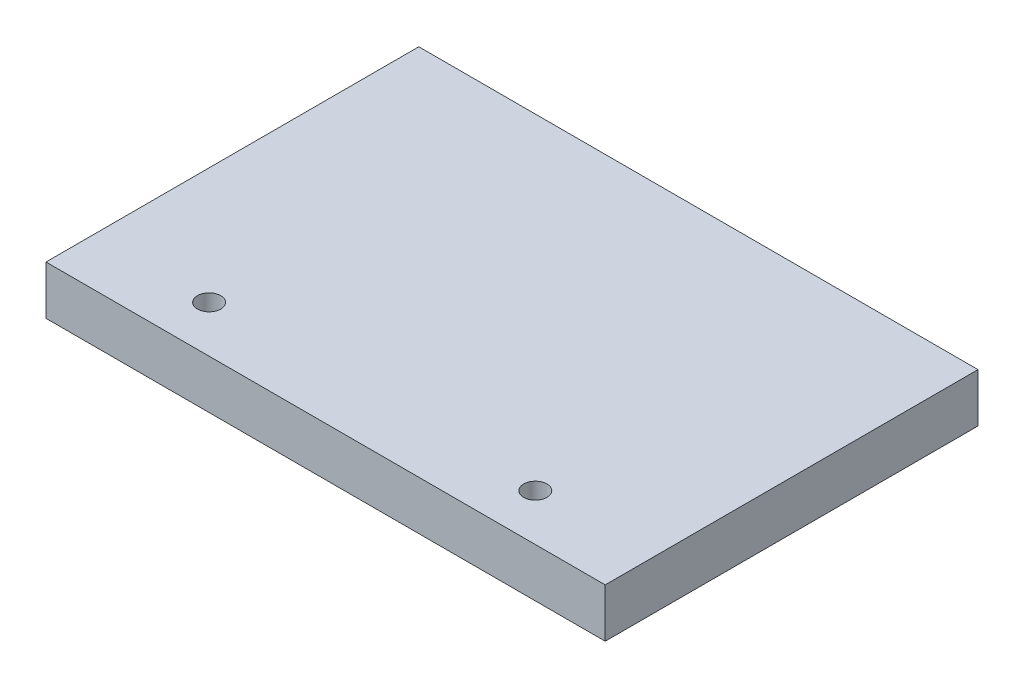
ISO-10303-21;
HEADER;
FILE_DESCRIPTION(('STEP AP214'),'2;1');
FILE_NAME('part.step','',(''),(''),'','','');
FILE_SCHEMA(('AUTOMOTIVE_DESIGN { 1 0 10303 214 1 1 1 1 }'));
ENDSEC;
DATA;
#1=APPLICATION_CONTEXT('core data for automotive mechanical design processes');
#2=APPLICATION_PROTOCOL_DEFINITION('international standard','automotive_design',2000,#1);
#3=PRODUCT_CONTEXT('',#1,'mechanical');
#4=PRODUCT('Part','Part','',(#3));
#5=PRODUCT_RELATED_PRODUCT_CATEGORY('part','',(#4));
#6=PRODUCT_DEFINITION_FORMATION('','',#4);
#7=PRODUCT_DEFINITION_CONTEXT('part definition',#1,'design');
#8=PRODUCT_DEFINITION('design','',#6,#7);
#9=PRODUCT_DEFINITION_SHAPE('','',#8);
#10=(LENGTH_UNIT() NAMED_UNIT(*) SI_UNIT(.MILLI.,.METRE.));
#11=(NAMED_UNIT(*) PLANE_ANGLE_UNIT() SI_UNIT($,.RADIAN.));
#12=(NAMED_UNIT(*) SI_UNIT($,.STERADIAN.) SOLID_ANGLE_UNIT());
#13=UNCERTAINTY_MEASURE_WITH_UNIT(LENGTH_MEASURE(1.E-05),#10,'distance_accuracy_value','');
#14=(GEOMETRIC_REPRESENTATION_CONTEXT(3) GLOBAL_UNCERTAINTY_ASSIGNED_CONTEXT((#13)) GLOBAL_UNIT_ASSIGNED_CONTEXT((#10,
#11,#12)) REPRESENTATION_CONTEXT('',''));
#15=CARTESIAN_POINT('',(0.,0.,0.));
#16=DIRECTION('',(0.,0.,1.));
#17=DIRECTION('',(1.,0.,0.));
#18=AXIS2_PLACEMENT_3D('',#15,#16,#17);
#19=CARTESIAN_POINT('',(0.,6.6548,0.));
#20=DIRECTION('',(1.,0.,0.));
#21=DIRECTION('',(0.,0.,-1.));
#22=AXIS2_PLACEMENT_3D('',#19,#20,#21);
#23=PLANE('',#22);
#24=DIRECTION('',(0.,0.,1.));
#25=VECTOR('',#24,1.);
#26=CARTESIAN_POINT('',(0.,0.,0.));
#27=LINE('',#26,#25);
#28=CARTESIAN_POINT('',(0.,0.,-50.8));
#29=VERTEX_POINT('',#28);
#30=CARTESIAN_POINT('',(0.,0.,0.));
#31=VERTEX_POINT('',#30);
#32=EDGE_CURVE('E95',#29,#31,#27,.T.);
#33=ORIENTED_EDGE('',*,*,#32,.T.);
#34=DIRECTION('',(0.,-1.,0.));
#35=VECTOR('',#34,1.);
#36=CARTESIAN_POINT('',(0.,6.6548,0.));
#37=LINE('',#36,#35);
#38=CARTESIAN_POINT('',(0.,6.6548,0.));
#39=VERTEX_POINT('',#38);
#40=EDGE_CURVE('E11',#39,#31,#37,.T.);
#41=ORIENTED_EDGE('',*,*,#40,.F.);
#42=DIRECTION('',(0.,0.,1.));
#43=VECTOR('',#42,1.);
#44=CARTESIAN_POINT('',(0.,6.6548,0.));
#45=LINE('',#44,#43);
#46=CARTESIAN_POINT('',(0.,6.6548,-50.8));
#47=VERTEX_POINT('',#46);
#48=EDGE_CURVE('E83',#47,#39,#45,.T.);
#49=ORIENTED_EDGE('',*,*,#48,.F.);
#50=DIRECTION('',(0.,-1.,0.));
#51=VECTOR('',#50,1.);
#52=CARTESIAN_POINT('',(0.,6.6548,-50.8));
#53=LINE('',#52,#51);
#54=EDGE_CURVE('E91',#47,#29,#53,.T.);
#55=ORIENTED_EDGE('',*,*,#54,.T.);
#56=EDGE_LOOP('',(#33,#41,#49,#55));
#57=FACE_BOUND('',#56,.T.);
#58=ADVANCED_FACE('F32',(#57),#23,.F.);
#59=CARTESIAN_POINT('',(0.,6.6548,0.));
#60=DIRECTION('',(0.,0.,-1.));
#61=DIRECTION('',(-1.,0.,0.));
#62=AXIS2_PLACEMENT_3D('',#59,#60,#61);
#63=PLANE('',#62);
#64=DIRECTION('',(1.,0.,0.));
#65=VECTOR('',#64,1.);
#66=CARTESIAN_POINT('',(0.,0.,0.));
#67=LINE('',#66,#65);
#68=CARTESIAN_POINT('',(76.2,0.,0.));
#69=VERTEX_POINT('',#68);
#70=EDGE_CURVE('E87',#31,#69,#67,.T.);
#71=ORIENTED_EDGE('',*,*,#70,.T.);
#72=DIRECTION('',(0.,-1.,0.));
#73=VECTOR('',#72,1.);
#74=CARTESIAN_POINT('',(76.2,6.6548,0.));
#75=LINE('',#74,#73);
#76=CARTESIAN_POINT('',(76.2,6.6548,0.));
#77=VERTEX_POINT('',#76);
#78=EDGE_CURVE('E40',#77,#69,#75,.T.);
#79=ORIENTED_EDGE('',*,*,#78,.F.);
#80=DIRECTION('',(1.,0.,0.));
#81=VECTOR('',#80,1.);
#82=CARTESIAN_POINT('',(0.,6.6548,0.));
#83=LINE('',#82,#81);
#84=EDGE_CURVE('E78',#39,#77,#83,.T.);
#85=ORIENTED_EDGE('',*,*,#84,.F.);
#86=ORIENTED_EDGE('',*,*,#40,.T.);
#87=EDGE_LOOP('',(#71,#79,#85,#86));
#88=FACE_BOUND('',#87,.T.);
#89=ADVANCED_FACE('F86',(#88),#63,.F.);
#90=CARTESIAN_POINT('',(76.2,6.6548,0.));
#91=DIRECTION('',(-1.,0.,0.));
#92=DIRECTION('',(0.,0.,1.));
#93=AXIS2_PLACEMENT_3D('',#90,#91,#92);
#94=PLANE('',#93);
#95=DIRECTION('',(0.,0.,-1.));
#96=VECTOR('',#95,1.);
#97=CARTESIAN_POINT('',(76.2,0.,0.));
#98=LINE('',#97,#96);
#99=CARTESIAN_POINT('',(76.2,0.,-50.8));
#100=VERTEX_POINT('',#99);
#101=EDGE_CURVE('E65',#69,#100,#98,.T.);
#102=ORIENTED_EDGE('',*,*,#101,.T.);
#103=DIRECTION('',(0.,-1.,0.));
#104=VECTOR('',#103,1.);
#105=CARTESIAN_POINT('',(76.2,6.6548,-50.8));
#106=LINE('',#105,#104);
#107=CARTESIAN_POINT('',(76.2,6.6548,-50.8));
#108=VERTEX_POINT('',#107);
#109=EDGE_CURVE('E88',#108,#100,#106,.T.);
#110=ORIENTED_EDGE('',*,*,#109,.F.);
#111=DIRECTION('',(0.,0.,-1.));
#112=VECTOR('',#111,1.);
#113=CARTESIAN_POINT('',(76.2,6.6548,0.));
#114=LINE('',#113,#112);
#115=EDGE_CURVE('E81',#77,#108,#114,.T.);
#116=ORIENTED_EDGE('',*,*,#115,.F.);
#117=ORIENTED_EDGE('',*,*,#78,.T.);
#118=EDGE_LOOP('',(#102,#110,#116,#117));
#119=FACE_BOUND('',#118,.T.);
#120=ADVANCED_FACE('F89',(#119),#94,.F.);
#121=CARTESIAN_POINT('',(0.,6.6548,-50.8));
#122=DIRECTION('',(0.,0.,1.));
#123=DIRECTION('',(1.,0.,0.));
#124=AXIS2_PLACEMENT_3D('',#121,#122,#123);
#125=PLANE('',#124);
#126=DIRECTION('',(-1.,0.,0.));
#127=VECTOR('',#126,1.);
#128=CARTESIAN_POINT('',(0.,0.,-50.8));
#129=LINE('',#128,#127);
#130=EDGE_CURVE('E71',#100,#29,#129,.T.);
#131=ORIENTED_EDGE('',*,*,#130,.T.);
#132=ORIENTED_EDGE('',*,*,#54,.F.);
#133=DIRECTION('',(-1.,0.,0.));
#134=VECTOR('',#133,1.);
#135=CARTESIAN_POINT('',(0.,6.6548,-50.8));
#136=LINE('',#135,#134);
#137=EDGE_CURVE('E48',#108,#47,#136,.T.);
#138=ORIENTED_EDGE('',*,*,#137,.F.);
#139=ORIENTED_EDGE('',*,*,#109,.T.);
#140=EDGE_LOOP('',(#131,#132,#138,#139));
#141=FACE_BOUND('',#140,.T.);
#142=ADVANCED_FACE('F103',(#141),#125,.F.);
#143=CARTESIAN_POINT('',(0.,6.6548,0.));
#144=DIRECTION('',(0.,-1.,0.));
#145=DIRECTION('',(0.,0.,-1.));
#146=AXIS2_PLACEMENT_3D('',#143,#144,#145);
#147=PLANE('',#146);
#148=CARTESIAN_POINT('',(15.875,6.6548,-6.35));
#149=DIRECTION('',(0.,1.,0.));
#150=DIRECTION('',(0.,0.,1.));
#151=AXIS2_PLACEMENT_3D('',#148,#149,#150);
#152=CIRCLE('',#151,1.5875);
#153=CARTESIAN_POINT('',(15.875,6.6548,-4.7625));
#154=VERTEX_POINT('',#153);
#155=EDGE_CURVE('E115',#154,#154,#152,.T.);
#156=ORIENTED_EDGE('',*,*,#155,.F.);
#157=EDGE_LOOP('',(#156));
#158=FACE_BOUND('',#157,.T.);
#159=CARTESIAN_POINT('',(60.325,6.6548,-6.35000000000001));
#160=DIRECTION('',(0.,1.,0.));
#161=DIRECTION('',(0.,0.,1.));
#162=AXIS2_PLACEMENT_3D('',#159,#160,#161);
#163=CIRCLE('',#162,1.5875);
#164=CARTESIAN_POINT('',(60.325,6.6548,-4.76250000000001));
#165=VERTEX_POINT('',#164);
#166=EDGE_CURVE('E109',#165,#165,#163,.T.);
#167=ORIENTED_EDGE('',*,*,#166,.F.);
#168=EDGE_LOOP('',(#167));
#169=FACE_BOUND('',#168,.T.);
#170=ORIENTED_EDGE('',*,*,#48,.T.);
#171=ORIENTED_EDGE('',*,*,#84,.T.);
#172=ORIENTED_EDGE('',*,*,#115,.T.);
#173=ORIENTED_EDGE('',*,*,#137,.T.);
#174=EDGE_LOOP('',(#170,#171,#172,#173));
#175=FACE_BOUND('',#174,.T.);
#176=ADVANCED_FACE('F79',(#158,#169,#175),#147,.F.);
#177=CARTESIAN_POINT('',(0.,0.,0.));
#178=DIRECTION('',(0.,-1.,0.));
#179=DIRECTION('',(0.,0.,-1.));
#180=AXIS2_PLACEMENT_3D('',#177,#178,#179);
#181=PLANE('',#180);
#182=CARTESIAN_POINT('',(15.875,0.,-6.35));
#183=DIRECTION('',(0.,1.,0.));
#184=DIRECTION('',(0.,0.,1.));
#185=AXIS2_PLACEMENT_3D('',#182,#183,#184);
#186=CIRCLE('',#185,1.5875);
#187=CARTESIAN_POINT('',(15.875,0.,-4.7625));
#188=VERTEX_POINT('',#187);
#189=EDGE_CURVE('E98',#188,#188,#186,.T.);
#190=ORIENTED_EDGE('',*,*,#189,.T.);
#191=EDGE_LOOP('',(#190));
#192=FACE_BOUND('',#191,.T.);
#193=CARTESIAN_POINT('',(60.325,0.,-6.35000000000001));
#194=DIRECTION('',(0.,1.,0.));
#195=DIRECTION('',(0.,0.,1.));
#196=AXIS2_PLACEMENT_3D('',#193,#194,#195);
#197=CIRCLE('',#196,1.5875);
#198=CARTESIAN_POINT('',(60.325,0.,-4.76250000000001));
#199=VERTEX_POINT('',#198);
#200=EDGE_CURVE('E112',#199,#199,#197,.T.);
#201=ORIENTED_EDGE('',*,*,#200,.T.);
#202=EDGE_LOOP('',(#201));
#203=FACE_BOUND('',#202,.T.);
#204=ORIENTED_EDGE('',*,*,#32,.F.);
#205=ORIENTED_EDGE('',*,*,#130,.F.);
#206=ORIENTED_EDGE('',*,*,#101,.F.);
#207=ORIENTED_EDGE('',*,*,#70,.F.);
#208=EDGE_LOOP('',(#204,#205,#206,#207));
#209=FACE_BOUND('',#208,.T.);
#210=ADVANCED_FACE('F106',(#192,#203,#209),#181,.T.);
#211=CARTESIAN_POINT('',(60.325,0.,-6.35000000000001));
#212=DIRECTION('',(0.,1.,0.));
#213=DIRECTION('',(0.,0.,1.));
#214=AXIS2_PLACEMENT_3D('',#211,#212,#213);
#215=CYLINDRICAL_SURFACE('',#214,1.5875);
#216=ORIENTED_EDGE('',*,*,#200,.F.);
#217=EDGE_LOOP('',(#216));
#218=FACE_BOUND('',#217,.T.);
#219=ORIENTED_EDGE('',*,*,#166,.T.);
#220=EDGE_LOOP('',(#219));
#221=FACE_BOUND('',#220,.T.);
#222=ADVANCED_FACE('F126',(#218,#221),#215,.F.);
#223=CARTESIAN_POINT('',(15.875,0.,-6.35));
#224=DIRECTION('',(0.,1.,0.));
#225=DIRECTION('',(0.,0.,1.));
#226=AXIS2_PLACEMENT_3D('',#223,#224,#225);
#227=CYLINDRICAL_SURFACE('',#226,1.5875);
#228=ORIENTED_EDGE('',*,*,#189,.F.);
#229=EDGE_LOOP('',(#228));
#230=FACE_BOUND('',#229,.T.);
#231=ORIENTED_EDGE('',*,*,#155,.T.);
#232=EDGE_LOOP('',(#231));
#233=FACE_BOUND('',#232,.T.);
#234=ADVANCED_FACE('F123',(#230,#233),#227,.F.);
#235=CLOSED_SHELL('',(#58,#89,#120,#142,#176,#210,#222,#234));
#236=MANIFOLD_SOLID_BREP('B2',#235);
#237=ADVANCED_BREP_SHAPE_REPRESENTATION('',(#18,#236),#14);
#238=SHAPE_DEFINITION_REPRESENTATION(#9,#237);
ENDSEC;
END-ISO-10303-21;
